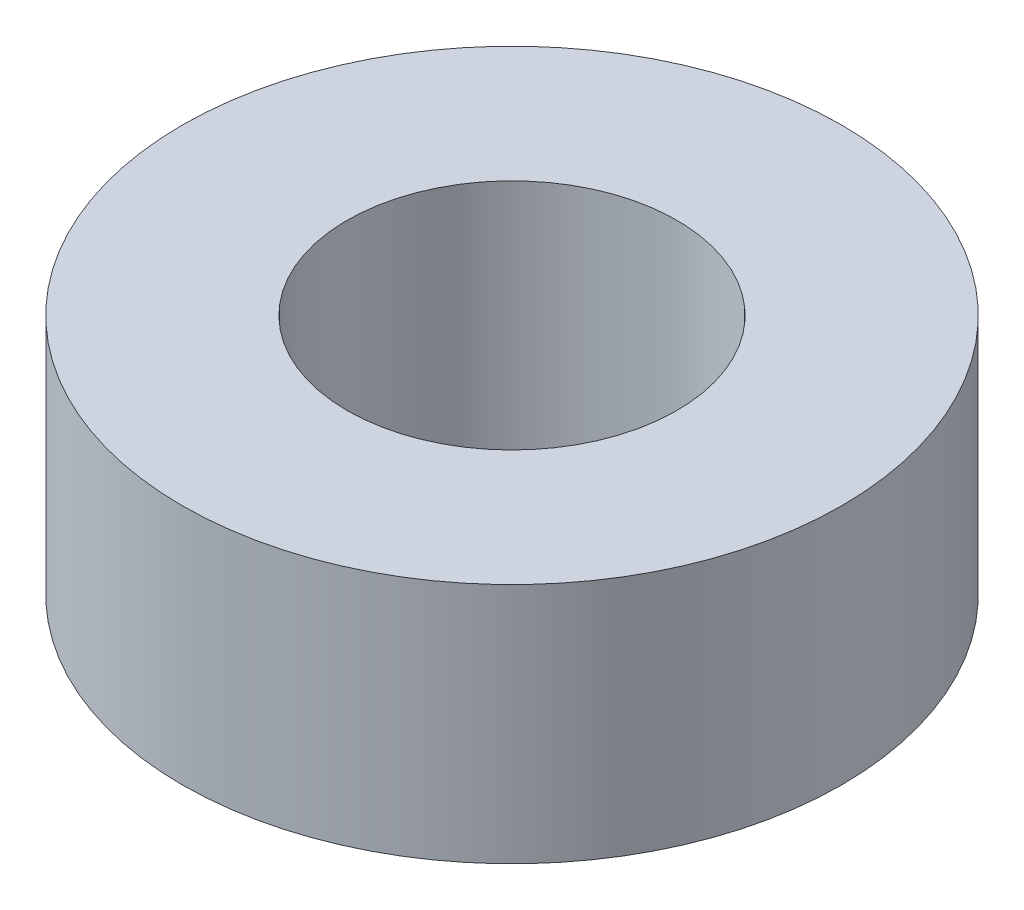
ISO-10303-21;
HEADER;
FILE_DESCRIPTION(('STEP AP214'),'2;1');
FILE_NAME('part.step','',(''),(''),'','','');
FILE_SCHEMA(('AUTOMOTIVE_DESIGN { 1 0 10303 214 1 1 1 1 }'));
ENDSEC;
DATA;
#1=APPLICATION_CONTEXT('core data for automotive mechanical design processes');
#2=APPLICATION_PROTOCOL_DEFINITION('international standard','automotive_design',2000,#1);
#3=PRODUCT_CONTEXT('',#1,'mechanical');
#4=PRODUCT('Part','Part','',(#3));
#5=PRODUCT_RELATED_PRODUCT_CATEGORY('part','',(#4));
#6=PRODUCT_DEFINITION_FORMATION('','',#4);
#7=PRODUCT_DEFINITION_CONTEXT('part definition',#1,'design');
#8=PRODUCT_DEFINITION('design','',#6,#7);
#9=PRODUCT_DEFINITION_SHAPE('','',#8);
#10=(LENGTH_UNIT() NAMED_UNIT(*) SI_UNIT(.MILLI.,.METRE.));
#11=(NAMED_UNIT(*) PLANE_ANGLE_UNIT() SI_UNIT($,.RADIAN.));
#12=(NAMED_UNIT(*) SI_UNIT($,.STERADIAN.) SOLID_ANGLE_UNIT());
#13=UNCERTAINTY_MEASURE_WITH_UNIT(LENGTH_MEASURE(1.E-05),#10,'distance_accuracy_value','');
#14=(GEOMETRIC_REPRESENTATION_CONTEXT(3) GLOBAL_UNCERTAINTY_ASSIGNED_CONTEXT((#13)) GLOBAL_UNIT_ASSIGNED_CONTEXT((#10,
#11,#12)) REPRESENTATION_CONTEXT('',''));
#15=CARTESIAN_POINT('',(0.,0.,0.));
#16=DIRECTION('',(0.,0.,1.));
#17=DIRECTION('',(1.,0.,0.));
#18=AXIS2_PLACEMENT_3D('',#15,#16,#17);
#19=CARTESIAN_POINT('',(0.,2.2,0.));
#20=DIRECTION('',(0.,1.,0.));
#21=DIRECTION('',(0.,0.,1.));
#22=AXIS2_PLACEMENT_3D('',#19,#20,#21);
#23=PLANE('',#22);
#24=CARTESIAN_POINT('',(0.,2.2,0.));
#25=DIRECTION('',(0.,1.,0.));
#26=DIRECTION('',(0.,0.,1.));
#27=AXIS2_PLACEMENT_3D('',#24,#25,#26);
#28=CIRCLE('',#27,3.);
#29=CARTESIAN_POINT('',(0.,2.2,3.));
#30=VERTEX_POINT('',#29);
#31=EDGE_CURVE('E10',#30,#30,#28,.T.);
#32=ORIENTED_EDGE('',*,*,#31,.T.);
#33=EDGE_LOOP('',(#32));
#34=FACE_BOUND('',#33,.T.);
#35=CARTESIAN_POINT('',(0.,2.2,0.));
#36=DIRECTION('',(0.,1.,0.));
#37=DIRECTION('',(0.,0.,1.));
#38=AXIS2_PLACEMENT_3D('',#35,#36,#37);
#39=CIRCLE('',#38,1.5);
#40=CARTESIAN_POINT('',(0.,2.2,1.5));
#41=VERTEX_POINT('',#40);
#42=EDGE_CURVE('E48',#41,#41,#39,.T.);
#43=ORIENTED_EDGE('',*,*,#42,.F.);
#44=EDGE_LOOP('',(#43));
#45=FACE_BOUND('',#44,.T.);
#46=ADVANCED_FACE('F37',(#34,#45),#23,.T.);
#47=CARTESIAN_POINT('',(0.,0.,0.));
#48=DIRECTION('',(0.,1.,0.));
#49=DIRECTION('',(0.,0.,1.));
#50=AXIS2_PLACEMENT_3D('',#47,#48,#49);
#51=PLANE('',#50);
#52=CARTESIAN_POINT('',(0.,0.,0.));
#53=DIRECTION('',(0.,1.,0.));
#54=DIRECTION('',(0.,0.,1.));
#55=AXIS2_PLACEMENT_3D('',#52,#53,#54);
#56=CIRCLE('',#55,3.);
#57=CARTESIAN_POINT('',(0.,0.,3.));
#58=VERTEX_POINT('',#57);
#59=EDGE_CURVE('E41',#58,#58,#56,.T.);
#60=ORIENTED_EDGE('',*,*,#59,.F.);
#61=EDGE_LOOP('',(#60));
#62=FACE_BOUND('',#61,.T.);
#63=CARTESIAN_POINT('',(0.,0.,0.));
#64=DIRECTION('',(0.,1.,0.));
#65=DIRECTION('',(0.,0.,1.));
#66=AXIS2_PLACEMENT_3D('',#63,#64,#65);
#67=CIRCLE('',#66,1.5);
#68=CARTESIAN_POINT('',(0.,0.,1.5));
#69=VERTEX_POINT('',#68);
#70=EDGE_CURVE('E50',#69,#69,#67,.T.);
#71=ORIENTED_EDGE('',*,*,#70,.T.);
#72=EDGE_LOOP('',(#71));
#73=FACE_BOUND('',#72,.T.);
#74=ADVANCED_FACE('F60',(#62,#73),#51,.F.);
#75=CARTESIAN_POINT('',(0.,2.2,0.));
#76=DIRECTION('',(0.,-1.,0.));
#77=DIRECTION('',(0.,0.,-1.));
#78=AXIS2_PLACEMENT_3D('',#75,#76,#77);
#79=CYLINDRICAL_SURFACE('',#78,3.);
#80=ORIENTED_EDGE('',*,*,#31,.F.);
#81=EDGE_LOOP('',(#80));
#82=FACE_BOUND('',#81,.T.);
#83=ORIENTED_EDGE('',*,*,#59,.T.);
#84=EDGE_LOOP('',(#83));
#85=FACE_BOUND('',#84,.T.);
#86=ADVANCED_FACE('F39',(#82,#85),#79,.T.);
#87=CARTESIAN_POINT('',(0.,2.2,0.));
#88=DIRECTION('',(0.,-1.,0.));
#89=DIRECTION('',(0.,0.,-1.));
#90=AXIS2_PLACEMENT_3D('',#87,#88,#89);
#91=CYLINDRICAL_SURFACE('',#90,1.5);
#92=ORIENTED_EDGE('',*,*,#42,.T.);
#93=EDGE_LOOP('',(#92));
#94=FACE_BOUND('',#93,.T.);
#95=ORIENTED_EDGE('',*,*,#70,.F.);
#96=EDGE_LOOP('',(#95));
#97=FACE_BOUND('',#96,.T.);
#98=ADVANCED_FACE('F56',(#94,#97),#91,.F.);
#99=CLOSED_SHELL('',(#46,#74,#86,#98));
#100=MANIFOLD_SOLID_BREP('B2',#99);
#101=ADVANCED_BREP_SHAPE_REPRESENTATION('',(#18,#100),#14);
#102=SHAPE_DEFINITION_REPRESENTATION(#9,#101);
ENDSEC;
END-ISO-10303-21;
